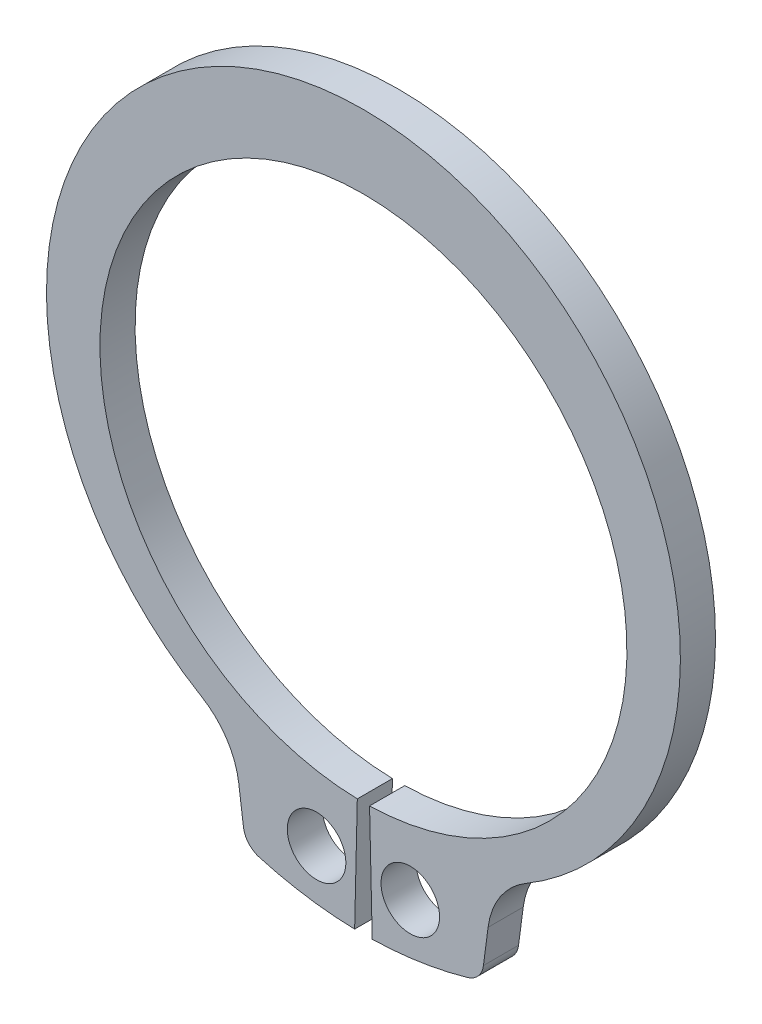
ISO-10303-21;
HEADER;
FILE_DESCRIPTION(('STEP AP214'),'2;1');
FILE_NAME('part.step','',(''),(''),'','','');
FILE_SCHEMA(('AUTOMOTIVE_DESIGN { 1 0 10303 214 1 1 1 1 }'));
ENDSEC;
DATA;
#1=APPLICATION_CONTEXT('core data for automotive mechanical design processes');
#2=APPLICATION_PROTOCOL_DEFINITION('international standard','automotive_design',2000,#1);
#3=PRODUCT_CONTEXT('',#1,'mechanical');
#4=PRODUCT('Part','Part','',(#3));
#5=PRODUCT_RELATED_PRODUCT_CATEGORY('part','',(#4));
#6=PRODUCT_DEFINITION_FORMATION('','',#4);
#7=PRODUCT_DEFINITION_CONTEXT('part definition',#1,'design');
#8=PRODUCT_DEFINITION('design','',#6,#7);
#9=PRODUCT_DEFINITION_SHAPE('','',#8);
#10=(LENGTH_UNIT() NAMED_UNIT(*) SI_UNIT(.MILLI.,.METRE.));
#11=(NAMED_UNIT(*) PLANE_ANGLE_UNIT() SI_UNIT($,.RADIAN.));
#12=(NAMED_UNIT(*) SI_UNIT($,.STERADIAN.) SOLID_ANGLE_UNIT());
#13=UNCERTAINTY_MEASURE_WITH_UNIT(LENGTH_MEASURE(1.E-05),#10,'distance_accuracy_value','');
#14=(GEOMETRIC_REPRESENTATION_CONTEXT(3) GLOBAL_UNCERTAINTY_ASSIGNED_CONTEXT((#13)) GLOBAL_UNIT_ASSIGNED_CONTEXT((#10,
#11,#12)) REPRESENTATION_CONTEXT('',''));
#15=CARTESIAN_POINT('',(0.,0.,0.));
#16=DIRECTION('',(0.,0.,1.));
#17=DIRECTION('',(1.,0.,0.));
#18=AXIS2_PLACEMENT_3D('',#15,#16,#17);
#19=CARTESIAN_POINT('',(0.,0.,-1.2));
#20=DIRECTION('',(0.,0.,1.));
#21=DIRECTION('',(1.,0.,0.));
#22=AXIS2_PLACEMENT_3D('',#19,#20,#21);
#23=CYLINDRICAL_SURFACE('',#22,9.);
#24=CARTESIAN_POINT('',(0.,0.,0.));
#25=DIRECTION('',(0.,0.,-1.));
#26=DIRECTION('',(1.,0.,0.));
#27=AXIS2_PLACEMENT_3D('',#24,#25,#26);
#28=CIRCLE('',#27,9.);
#29=CARTESIAN_POINT('',(-0.209302325581395,-8.99756592287637,0.));
#30=VERTEX_POINT('',#29);
#31=CARTESIAN_POINT('',(0.209302325581395,-8.99756592287637,0.));
#32=VERTEX_POINT('',#31);
#33=EDGE_CURVE('E157',#30,#32,#28,.T.);
#34=ORIENTED_EDGE('',*,*,#33,.F.);
#35=DIRECTION('',(0.,0.,1.));
#36=VECTOR('',#35,1.);
#37=CARTESIAN_POINT('',(-0.209302325581395,-8.99756592287637,-1.2));
#38=LINE('',#37,#36);
#39=CARTESIAN_POINT('',(-0.209302325581395,-8.99756592287637,-1.2));
#40=VERTEX_POINT('',#39);
#41=EDGE_CURVE('E11',#40,#30,#38,.T.);
#42=ORIENTED_EDGE('',*,*,#41,.F.);
#43=CARTESIAN_POINT('',(0.,0.,-1.2));
#44=DIRECTION('',(0.,0.,-1.));
#45=DIRECTION('',(1.,0.,0.));
#46=AXIS2_PLACEMENT_3D('',#43,#44,#45);
#47=CIRCLE('',#46,9.);
#48=CARTESIAN_POINT('',(0.209302325581395,-8.99756592287637,-1.2));
#49=VERTEX_POINT('',#48);
#50=EDGE_CURVE('E190',#40,#49,#47,.T.);
#51=ORIENTED_EDGE('',*,*,#50,.T.);
#52=DIRECTION('',(0.,0.,1.));
#53=VECTOR('',#52,1.);
#54=CARTESIAN_POINT('',(0.209302325581395,-8.99756592287637,-1.2));
#55=LINE('',#54,#53);
#56=EDGE_CURVE('E39',#49,#32,#55,.T.);
#57=ORIENTED_EDGE('',*,*,#56,.T.);
#58=EDGE_LOOP('',(#34,#42,#51,#57));
#59=FACE_BOUND('',#58,.T.);
#60=ADVANCED_FACE('F36',(#59),#23,.F.);
#61=CARTESIAN_POINT('',(-0.209302325581395,-8.99756592287637,-1.2));
#62=DIRECTION('',(0.999729546986264,-0.0232558139534884,0.));
#63=DIRECTION('',(0.0232558139534884,0.999729546986264,0.));
#64=AXIS2_PLACEMENT_3D('',#61,#62,#63);
#65=PLANE('',#64);
#66=DIRECTION('',(0.0232558139534884,0.999729546986264,0.));
#67=VECTOR('',#66,1.);
#68=CARTESIAN_POINT('',(-0.209302325581395,-8.99756592287637,0.));
#69=LINE('',#68,#67);
#70=CARTESIAN_POINT('',(-0.3,-12.8965111561228,0.));
#71=VERTEX_POINT('',#70);
#72=EDGE_CURVE('E188',#71,#30,#69,.T.);
#73=ORIENTED_EDGE('',*,*,#72,.F.);
#74=DIRECTION('',(0.,0.,1.));
#75=VECTOR('',#74,1.);
#76=CARTESIAN_POINT('',(-0.3,-12.8965111561228,-1.2));
#77=LINE('',#76,#75);
#78=CARTESIAN_POINT('',(-0.3,-12.8965111561228,-1.2));
#79=VERTEX_POINT('',#78);
#80=EDGE_CURVE('E45',#79,#71,#77,.T.);
#81=ORIENTED_EDGE('',*,*,#80,.F.);
#82=DIRECTION('',(0.0232558139534884,0.999729546986264,0.));
#83=VECTOR('',#82,1.);
#84=CARTESIAN_POINT('',(-0.209302325581395,-8.99756592287637,-1.2));
#85=LINE('',#84,#83);
#86=EDGE_CURVE('E147',#79,#40,#85,.T.);
#87=ORIENTED_EDGE('',*,*,#86,.T.);
#88=ORIENTED_EDGE('',*,*,#41,.T.);
#89=EDGE_LOOP('',(#73,#81,#87,#88));
#90=FACE_BOUND('',#89,.T.);
#91=ADVANCED_FACE('F210',(#90),#65,.T.);
#92=CARTESIAN_POINT('',(0.,0.,-1.2));
#93=DIRECTION('',(0.,0.,1.));
#94=DIRECTION('',(1.,0.,0.));
#95=AXIS2_PLACEMENT_3D('',#92,#93,#94);
#96=CYLINDRICAL_SURFACE('',#95,12.9);
#97=CARTESIAN_POINT('',(0.,0.,0.));
#98=DIRECTION('',(0.,0.,1.));
#99=DIRECTION('',(1.,0.,0.));
#100=AXIS2_PLACEMENT_3D('',#97,#98,#99);
#101=CIRCLE('',#100,12.9);
#102=CARTESIAN_POINT('',(-3.56180012924144,-12.3985313581624,0.));
#103=VERTEX_POINT('',#102);
#104=EDGE_CURVE('E134',#103,#71,#101,.T.);
#105=ORIENTED_EDGE('',*,*,#104,.F.);
#106=DIRECTION('',(0.,0.,1.));
#107=VECTOR('',#106,1.);
#108=CARTESIAN_POINT('',(-3.56180012924144,-12.3985313581624,-1.2));
#109=LINE('',#108,#107);
#110=CARTESIAN_POINT('',(-3.56180012924144,-12.3985313581624,-1.2));
#111=VERTEX_POINT('',#110);
#112=EDGE_CURVE('E129',#111,#103,#109,.T.);
#113=ORIENTED_EDGE('',*,*,#112,.F.);
#114=CARTESIAN_POINT('',(0.,0.,-1.2));
#115=DIRECTION('',(0.,0.,1.));
#116=DIRECTION('',(1.,0.,0.));
#117=AXIS2_PLACEMENT_3D('',#114,#115,#116);
#118=CIRCLE('',#117,12.9);
#119=EDGE_CURVE('E132',#111,#79,#118,.T.);
#120=ORIENTED_EDGE('',*,*,#119,.T.);
#121=ORIENTED_EDGE('',*,*,#80,.T.);
#122=EDGE_LOOP('',(#105,#113,#120,#121));
#123=FACE_BOUND('',#122,.T.);
#124=ADVANCED_FACE('F131',(#123),#96,.T.);
#125=CARTESIAN_POINT('',(-3.35471872637856,-11.6776865117576,-1.2));
#126=DIRECTION('',(0.,0.,1.));
#127=DIRECTION('',(1.,0.,0.));
#128=AXIS2_PLACEMENT_3D('',#125,#126,#127);
#129=CYLINDRICAL_SURFACE('',#128,0.749999999999998);
#130=CARTESIAN_POINT('',(-3.35471872637856,-11.6776865117576,0.));
#131=DIRECTION('',(0.,0.,1.));
#132=DIRECTION('',(1.,0.,0.));
#133=AXIS2_PLACEMENT_3D('',#130,#131,#132);
#134=CIRCLE('',#133,0.749999999999998);
#135=CARTESIAN_POINT('',(-4.09830237240892,-11.7755811559226,0.));
#136=VERTEX_POINT('',#135);
#137=EDGE_CURVE('E185',#136,#103,#134,.T.);
#138=ORIENTED_EDGE('',*,*,#137,.F.);
#139=DIRECTION('',(0.,0.,1.));
#140=VECTOR('',#139,1.);
#141=CARTESIAN_POINT('',(-4.09830237240892,-11.7755811559226,-1.2));
#142=LINE('',#141,#140);
#143=CARTESIAN_POINT('',(-4.09830237240892,-11.7755811559226,-1.2));
#144=VERTEX_POINT('',#143);
#145=EDGE_CURVE('E139',#144,#136,#142,.T.);
#146=ORIENTED_EDGE('',*,*,#145,.F.);
#147=CARTESIAN_POINT('',(-3.35471872637856,-11.6776865117576,-1.2));
#148=DIRECTION('',(0.,0.,1.));
#149=DIRECTION('',(1.,0.,0.));
#150=AXIS2_PLACEMENT_3D('',#147,#148,#149);
#151=CIRCLE('',#150,0.749999999999998);
#152=EDGE_CURVE('E145',#144,#111,#151,.T.);
#153=ORIENTED_EDGE('',*,*,#152,.T.);
#154=ORIENTED_EDGE('',*,*,#112,.T.);
#155=EDGE_LOOP('',(#138,#146,#153,#154));
#156=FACE_BOUND('',#155,.T.);
#157=ADVANCED_FACE('F149',(#156),#129,.T.);
#158=CARTESIAN_POINT('',(-4.25782020599012,-10.5639229154452,-1.2));
#159=DIRECTION('',(-0.99144486137381,-0.130526192220052,0.));
#160=DIRECTION('',(0.130526192220052,-0.99144486137381,0.));
#161=AXIS2_PLACEMENT_3D('',#158,#159,#160);
#162=PLANE('',#161);
#163=DIRECTION('',(0.130526192220052,-0.99144486137381,0.));
#164=VECTOR('',#163,1.);
#165=CARTESIAN_POINT('',(-4.25782020599012,-10.5639229154452,0.));
#166=LINE('',#165,#164);
#167=CARTESIAN_POINT('',(-4.25782020599012,-10.5639229154452,0.));
#168=VERTEX_POINT('',#167);
#169=EDGE_CURVE('E182',#168,#136,#166,.T.);
#170=ORIENTED_EDGE('',*,*,#169,.F.);
#171=DIRECTION('',(0.,0.,1.));
#172=VECTOR('',#171,1.);
#173=CARTESIAN_POINT('',(-4.25782020599012,-10.5639229154452,-1.2));
#174=LINE('',#173,#172);
#175=CARTESIAN_POINT('',(-4.25782020599012,-10.5639229154452,-1.2));
#176=VERTEX_POINT('',#175);
#177=EDGE_CURVE('E194',#176,#168,#174,.T.);
#178=ORIENTED_EDGE('',*,*,#177,.F.);
#179=DIRECTION('',(0.130526192220052,-0.99144486137381,0.));
#180=VECTOR('',#179,1.);
#181=CARTESIAN_POINT('',(-4.25782020599012,-10.5639229154452,-1.2));
#182=LINE('',#181,#180);
#183=EDGE_CURVE('E150',#176,#144,#182,.T.);
#184=ORIENTED_EDGE('',*,*,#183,.T.);
#185=ORIENTED_EDGE('',*,*,#145,.T.);
#186=EDGE_LOOP('',(#170,#178,#184,#185));
#187=FACE_BOUND('',#186,.T.);
#188=ADVANCED_FACE('F223',(#187),#162,.T.);
#189=CARTESIAN_POINT('',(-6.88398382258035,-10.9096639146425,-1.2));
#190=DIRECTION('',(0.,0.,1.));
#191=DIRECTION('',(1.,0.,0.));
#192=AXIS2_PLACEMENT_3D('',#189,#190,#191);
#193=CYLINDRICAL_SURFACE('',#192,2.64882467891482);
#194=CARTESIAN_POINT('',(-6.88398382258035,-10.9096639146425,0.));
#195=DIRECTION('',(0.,0.,-1.));
#196=DIRECTION('',(1.,0.,0.));
#197=AXIS2_PLACEMENT_3D('',#194,#195,#196);
#198=CIRCLE('',#197,2.64882467891482);
#199=CARTESIAN_POINT('',(-5.53075827811954,-8.6325928122289,0.));
#200=VERTEX_POINT('',#199);
#201=EDGE_CURVE('E179',#200,#168,#198,.T.);
#202=ORIENTED_EDGE('',*,*,#201,.F.);
#203=DIRECTION('',(0.,0.,1.));
#204=VECTOR('',#203,1.);
#205=CARTESIAN_POINT('',(-5.53075827811954,-8.6325928122289,-1.2));
#206=LINE('',#205,#204);
#207=CARTESIAN_POINT('',(-5.53075827811954,-8.6325928122289,-1.2));
#208=VERTEX_POINT('',#207);
#209=EDGE_CURVE('E196',#208,#200,#206,.T.);
#210=ORIENTED_EDGE('',*,*,#209,.F.);
#211=CARTESIAN_POINT('',(-6.88398382258035,-10.9096639146425,-1.2));
#212=DIRECTION('',(0.,0.,-1.));
#213=DIRECTION('',(1.,0.,0.));
#214=AXIS2_PLACEMENT_3D('',#211,#212,#213);
#215=CIRCLE('',#214,2.64882467891482);
#216=EDGE_CURVE('E152',#208,#176,#215,.T.);
#217=ORIENTED_EDGE('',*,*,#216,.T.);
#218=ORIENTED_EDGE('',*,*,#177,.T.);
#219=EDGE_LOOP('',(#202,#210,#217,#218));
#220=FACE_BOUND('',#219,.T.);
#221=ADVANCED_FACE('F226',(#220),#193,.F.);
#222=CARTESIAN_POINT('',(0.,0.674007924870493,-1.2));
#223=DIRECTION('',(0.,0.,1.));
#224=DIRECTION('',(1.,0.,0.));
#225=AXIS2_PLACEMENT_3D('',#222,#223,#224);
#226=CYLINDRICAL_SURFACE('',#225,10.8259920751295);
#227=CARTESIAN_POINT('',(0.,0.674007924870493,0.));
#228=DIRECTION('',(0.,0.,1.));
#229=DIRECTION('',(1.,0.,0.));
#230=AXIS2_PLACEMENT_3D('',#227,#228,#229);
#231=CIRCLE('',#230,10.8259920751295);
#232=CARTESIAN_POINT('',(5.53075827811955,-8.6325928122289,0.));
#233=VERTEX_POINT('',#232);
#234=EDGE_CURVE('E176',#233,#200,#231,.T.);
#235=ORIENTED_EDGE('',*,*,#234,.F.);
#236=DIRECTION('',(0.,0.,1.));
#237=VECTOR('',#236,1.);
#238=CARTESIAN_POINT('',(5.53075827811955,-8.6325928122289,-1.2));
#239=LINE('',#238,#237);
#240=CARTESIAN_POINT('',(5.53075827811955,-8.6325928122289,-1.2));
#241=VERTEX_POINT('',#240);
#242=EDGE_CURVE('E198',#241,#233,#239,.T.);
#243=ORIENTED_EDGE('',*,*,#242,.F.);
#244=CARTESIAN_POINT('',(0.,0.674007924870493,-1.2));
#245=DIRECTION('',(0.,0.,1.));
#246=DIRECTION('',(1.,0.,0.));
#247=AXIS2_PLACEMENT_3D('',#244,#245,#246);
#248=CIRCLE('',#247,10.8259920751295);
#249=EDGE_CURVE('E300',#241,#208,#248,.T.);
#250=ORIENTED_EDGE('',*,*,#249,.T.);
#251=ORIENTED_EDGE('',*,*,#209,.T.);
#252=EDGE_LOOP('',(#235,#243,#250,#251));
#253=FACE_BOUND('',#252,.T.);
#254=ADVANCED_FACE('F230',(#253),#226,.T.);
#255=CARTESIAN_POINT('',(6.88398382258035,-10.9096639146425,-1.2));
#256=DIRECTION('',(0.,0.,1.));
#257=DIRECTION('',(1.,0.,0.));
#258=AXIS2_PLACEMENT_3D('',#255,#256,#257);
#259=CYLINDRICAL_SURFACE('',#258,2.64882467891482);
#260=CARTESIAN_POINT('',(6.88398382258035,-10.9096639146425,0.));
#261=DIRECTION('',(0.,0.,-1.));
#262=DIRECTION('',(1.,0.,0.));
#263=AXIS2_PLACEMENT_3D('',#260,#261,#262);
#264=CIRCLE('',#263,2.64882467891482);
#265=CARTESIAN_POINT('',(4.25782020599012,-10.5639229154452,0.));
#266=VERTEX_POINT('',#265);
#267=EDGE_CURVE('E173',#266,#233,#264,.T.);
#268=ORIENTED_EDGE('',*,*,#267,.F.);
#269=DIRECTION('',(0.,0.,1.));
#270=VECTOR('',#269,1.);
#271=CARTESIAN_POINT('',(4.25782020599012,-10.5639229154452,-1.2));
#272=LINE('',#271,#270);
#273=CARTESIAN_POINT('',(4.25782020599012,-10.5639229154452,-1.2));
#274=VERTEX_POINT('',#273);
#275=EDGE_CURVE('E200',#274,#266,#272,.T.);
#276=ORIENTED_EDGE('',*,*,#275,.F.);
#277=CARTESIAN_POINT('',(6.88398382258035,-10.9096639146425,-1.2));
#278=DIRECTION('',(0.,0.,-1.));
#279=DIRECTION('',(1.,0.,0.));
#280=AXIS2_PLACEMENT_3D('',#277,#278,#279);
#281=CIRCLE('',#280,2.64882467891482);
#282=EDGE_CURVE('E297',#274,#241,#281,.T.);
#283=ORIENTED_EDGE('',*,*,#282,.T.);
#284=ORIENTED_EDGE('',*,*,#242,.T.);
#285=EDGE_LOOP('',(#268,#276,#283,#284));
#286=FACE_BOUND('',#285,.T.);
#287=ADVANCED_FACE('F234',(#286),#259,.F.);
#288=CARTESIAN_POINT('',(4.25782020599012,-10.5639229154452,-1.2));
#289=DIRECTION('',(0.99144486137381,-0.130526192220052,0.));
#290=DIRECTION('',(0.130526192220052,0.99144486137381,0.));
#291=AXIS2_PLACEMENT_3D('',#288,#289,#290);
#292=PLANE('',#291);
#293=DIRECTION('',(0.130526192220052,0.99144486137381,0.));
#294=VECTOR('',#293,1.);
#295=CARTESIAN_POINT('',(4.25782020599012,-10.5639229154452,0.));
#296=LINE('',#295,#294);
#297=CARTESIAN_POINT('',(4.09830237240892,-11.7755811559226,0.));
#298=VERTEX_POINT('',#297);
#299=EDGE_CURVE('E170',#298,#266,#296,.T.);
#300=ORIENTED_EDGE('',*,*,#299,.F.);
#301=DIRECTION('',(0.,0.,1.));
#302=VECTOR('',#301,1.);
#303=CARTESIAN_POINT('',(4.09830237240892,-11.7755811559226,-1.2));
#304=LINE('',#303,#302);
#305=CARTESIAN_POINT('',(4.09830237240892,-11.7755811559226,-1.2));
#306=VERTEX_POINT('',#305);
#307=EDGE_CURVE('E202',#306,#298,#304,.T.);
#308=ORIENTED_EDGE('',*,*,#307,.F.);
#309=DIRECTION('',(0.130526192220052,0.99144486137381,0.));
#310=VECTOR('',#309,1.);
#311=CARTESIAN_POINT('',(4.25782020599012,-10.5639229154452,-1.2));
#312=LINE('',#311,#310);
#313=EDGE_CURVE('E294',#306,#274,#312,.T.);
#314=ORIENTED_EDGE('',*,*,#313,.T.);
#315=ORIENTED_EDGE('',*,*,#275,.T.);
#316=EDGE_LOOP('',(#300,#308,#314,#315));
#317=FACE_BOUND('',#316,.T.);
#318=ADVANCED_FACE('F238',(#317),#292,.T.);
#319=CARTESIAN_POINT('',(3.35471872637856,-11.6776865117576,-1.2));
#320=DIRECTION('',(0.,0.,1.));
#321=DIRECTION('',(1.,0.,0.));
#322=AXIS2_PLACEMENT_3D('',#319,#320,#321);
#323=CYLINDRICAL_SURFACE('',#322,0.749999999999998);
#324=CARTESIAN_POINT('',(3.35471872637856,-11.6776865117576,0.));
#325=DIRECTION('',(0.,0.,1.));
#326=DIRECTION('',(-1.,0.,0.));
#327=AXIS2_PLACEMENT_3D('',#324,#325,#326);
#328=CIRCLE('',#327,0.749999999999998);
#329=CARTESIAN_POINT('',(3.56180012924144,-12.3985313581624,0.));
#330=VERTEX_POINT('',#329);
#331=EDGE_CURVE('E167',#330,#298,#328,.T.);
#332=ORIENTED_EDGE('',*,*,#331,.F.);
#333=DIRECTION('',(0.,0.,1.));
#334=VECTOR('',#333,1.);
#335=CARTESIAN_POINT('',(3.56180012924144,-12.3985313581624,-1.2));
#336=LINE('',#335,#334);
#337=CARTESIAN_POINT('',(3.56180012924144,-12.3985313581624,-1.2));
#338=VERTEX_POINT('',#337);
#339=EDGE_CURVE('E204',#338,#330,#336,.T.);
#340=ORIENTED_EDGE('',*,*,#339,.F.);
#341=CARTESIAN_POINT('',(3.35471872637856,-11.6776865117576,-1.2));
#342=DIRECTION('',(0.,0.,1.));
#343=DIRECTION('',(-1.,0.,0.));
#344=AXIS2_PLACEMENT_3D('',#341,#342,#343);
#345=CIRCLE('',#344,0.749999999999998);
#346=EDGE_CURVE('E291',#338,#306,#345,.T.);
#347=ORIENTED_EDGE('',*,*,#346,.T.);
#348=ORIENTED_EDGE('',*,*,#307,.T.);
#349=EDGE_LOOP('',(#332,#340,#347,#348));
#350=FACE_BOUND('',#349,.T.);
#351=ADVANCED_FACE('F242',(#350),#323,.T.);
#352=CARTESIAN_POINT('',(0.,0.,-1.2));
#353=DIRECTION('',(0.,0.,1.));
#354=DIRECTION('',(1.,0.,0.));
#355=AXIS2_PLACEMENT_3D('',#352,#353,#354);
#356=CYLINDRICAL_SURFACE('',#355,12.9);
#357=CARTESIAN_POINT('',(0.,0.,0.));
#358=DIRECTION('',(0.,0.,1.));
#359=DIRECTION('',(1.,0.,0.));
#360=AXIS2_PLACEMENT_3D('',#357,#358,#359);
#361=CIRCLE('',#360,12.9);
#362=CARTESIAN_POINT('',(0.299999999999995,-12.8965111561228,0.));
#363=VERTEX_POINT('',#362);
#364=EDGE_CURVE('E164',#363,#330,#361,.T.);
#365=ORIENTED_EDGE('',*,*,#364,.F.);
#366=DIRECTION('',(0.,0.,1.));
#367=VECTOR('',#366,1.);
#368=CARTESIAN_POINT('',(0.299999999999995,-12.8965111561228,-1.2));
#369=LINE('',#368,#367);
#370=CARTESIAN_POINT('',(0.299999999999995,-12.8965111561228,-1.2));
#371=VERTEX_POINT('',#370);
#372=EDGE_CURVE('E205',#371,#363,#369,.T.);
#373=ORIENTED_EDGE('',*,*,#372,.F.);
#374=CARTESIAN_POINT('',(0.,0.,-1.2));
#375=DIRECTION('',(0.,0.,1.));
#376=DIRECTION('',(1.,0.,0.));
#377=AXIS2_PLACEMENT_3D('',#374,#375,#376);
#378=CIRCLE('',#377,12.9);
#379=EDGE_CURVE('E288',#371,#338,#378,.T.);
#380=ORIENTED_EDGE('',*,*,#379,.T.);
#381=ORIENTED_EDGE('',*,*,#339,.T.);
#382=EDGE_LOOP('',(#365,#373,#380,#381));
#383=FACE_BOUND('',#382,.T.);
#384=ADVANCED_FACE('F246',(#383),#356,.T.);
#385=CARTESIAN_POINT('',(0.209302325581395,-8.99756592287637,-1.2));
#386=DIRECTION('',(-0.999729546986264,-0.0232558139534884,0.));
#387=DIRECTION('',(0.0232558139534884,-0.999729546986264,0.));
#388=AXIS2_PLACEMENT_3D('',#385,#386,#387);
#389=PLANE('',#388);
#390=DIRECTION('',(0.0232558139534884,-0.999729546986264,0.));
#391=VECTOR('',#390,1.);
#392=CARTESIAN_POINT('',(0.209302325581395,-8.99756592287637,0.));
#393=LINE('',#392,#391);
#394=EDGE_CURVE('E160',#32,#363,#393,.T.);
#395=ORIENTED_EDGE('',*,*,#394,.F.);
#396=ORIENTED_EDGE('',*,*,#56,.F.);
#397=DIRECTION('',(0.0232558139534884,-0.999729546986264,0.));
#398=VECTOR('',#397,1.);
#399=CARTESIAN_POINT('',(0.209302325581395,-8.99756592287637,-1.2));
#400=LINE('',#399,#398);
#401=EDGE_CURVE('E286',#49,#371,#400,.T.);
#402=ORIENTED_EDGE('',*,*,#401,.T.);
#403=ORIENTED_EDGE('',*,*,#372,.T.);
#404=EDGE_LOOP('',(#395,#396,#402,#403));
#405=FACE_BOUND('',#404,.T.);
#406=ADVANCED_FACE('F207',(#405),#389,.T.);
#407=CARTESIAN_POINT('',(0.,0.,-1.2));
#408=DIRECTION('',(0.,0.,1.));
#409=DIRECTION('',(1.,0.,0.));
#410=AXIS2_PLACEMENT_3D('',#407,#408,#409);
#411=PLANE('',#410);
#412=CARTESIAN_POINT('',(-1.6,-11.0851251684408,-1.2));
#413=DIRECTION('',(0.,0.,1.));
#414=DIRECTION('',(1.,0.,0.));
#415=AXIS2_PLACEMENT_3D('',#412,#413,#414);
#416=CIRCLE('',#415,1.);
#417=CARTESIAN_POINT('',(-0.6,-11.0851251684408,-1.2));
#418=VERTEX_POINT('',#417);
#419=EDGE_CURVE('E273',#418,#418,#416,.T.);
#420=ORIENTED_EDGE('',*,*,#419,.T.);
#421=EDGE_LOOP('',(#420));
#422=FACE_BOUND('',#421,.T.);
#423=CARTESIAN_POINT('',(1.6,-11.0851251684408,-1.2));
#424=DIRECTION('',(0.,0.,1.));
#425=DIRECTION('',(1.,0.,0.));
#426=AXIS2_PLACEMENT_3D('',#423,#424,#425);
#427=CIRCLE('',#426,1.);
#428=CARTESIAN_POINT('',(2.6,-11.0851251684408,-1.2));
#429=VERTEX_POINT('',#428);
#430=EDGE_CURVE('E161',#429,#429,#427,.T.);
#431=ORIENTED_EDGE('',*,*,#430,.T.);
#432=EDGE_LOOP('',(#431));
#433=FACE_BOUND('',#432,.T.);
#434=ORIENTED_EDGE('',*,*,#50,.F.);
#435=ORIENTED_EDGE('',*,*,#86,.F.);
#436=ORIENTED_EDGE('',*,*,#119,.F.);
#437=ORIENTED_EDGE('',*,*,#152,.F.);
#438=ORIENTED_EDGE('',*,*,#183,.F.);
#439=ORIENTED_EDGE('',*,*,#216,.F.);
#440=ORIENTED_EDGE('',*,*,#249,.F.);
#441=ORIENTED_EDGE('',*,*,#282,.F.);
#442=ORIENTED_EDGE('',*,*,#313,.F.);
#443=ORIENTED_EDGE('',*,*,#346,.F.);
#444=ORIENTED_EDGE('',*,*,#379,.F.);
#445=ORIENTED_EDGE('',*,*,#401,.F.);
#446=EDGE_LOOP('',(#434,#435,#436,#437,#438,#439,#440,#441,#442,#443,#444,#445));
#447=FACE_BOUND('',#446,.T.);
#448=ADVANCED_FACE('F143',(#422,#433,#447),#411,.F.);
#449=CARTESIAN_POINT('',(0.,0.,0.));
#450=DIRECTION('',(0.,0.,1.));
#451=DIRECTION('',(1.,0.,0.));
#452=AXIS2_PLACEMENT_3D('',#449,#450,#451);
#453=PLANE('',#452);
#454=CARTESIAN_POINT('',(-1.6,-11.0851251684408,0.));
#455=DIRECTION('',(0.,0.,1.));
#456=DIRECTION('',(1.,0.,0.));
#457=AXIS2_PLACEMENT_3D('',#454,#455,#456);
#458=CIRCLE('',#457,1.);
#459=CARTESIAN_POINT('',(-0.6,-11.0851251684408,0.));
#460=VERTEX_POINT('',#459);
#461=EDGE_CURVE('E276',#460,#460,#458,.T.);
#462=ORIENTED_EDGE('',*,*,#461,.F.);
#463=EDGE_LOOP('',(#462));
#464=FACE_BOUND('',#463,.T.);
#465=CARTESIAN_POINT('',(1.6,-11.0851251684408,0.));
#466=DIRECTION('',(0.,0.,1.));
#467=DIRECTION('',(1.,0.,0.));
#468=AXIS2_PLACEMENT_3D('',#465,#466,#467);
#469=CIRCLE('',#468,1.);
#470=CARTESIAN_POINT('',(2.6,-11.0851251684408,0.));
#471=VERTEX_POINT('',#470);
#472=EDGE_CURVE('E278',#471,#471,#469,.T.);
#473=ORIENTED_EDGE('',*,*,#472,.F.);
#474=EDGE_LOOP('',(#473));
#475=FACE_BOUND('',#474,.T.);
#476=ORIENTED_EDGE('',*,*,#33,.T.);
#477=ORIENTED_EDGE('',*,*,#394,.T.);
#478=ORIENTED_EDGE('',*,*,#364,.T.);
#479=ORIENTED_EDGE('',*,*,#331,.T.);
#480=ORIENTED_EDGE('',*,*,#299,.T.);
#481=ORIENTED_EDGE('',*,*,#267,.T.);
#482=ORIENTED_EDGE('',*,*,#234,.T.);
#483=ORIENTED_EDGE('',*,*,#201,.T.);
#484=ORIENTED_EDGE('',*,*,#169,.T.);
#485=ORIENTED_EDGE('',*,*,#137,.T.);
#486=ORIENTED_EDGE('',*,*,#104,.T.);
#487=ORIENTED_EDGE('',*,*,#72,.T.);
#488=EDGE_LOOP('',(#476,#477,#478,#479,#480,#481,#482,#483,#484,#485,#486,#487));
#489=FACE_BOUND('',#488,.T.);
#490=ADVANCED_FACE('F209',(#464,#475,#489),#453,.T.);
#491=CARTESIAN_POINT('',(1.6,-11.0851251684408,-1.2));
#492=DIRECTION('',(0.,0.,1.));
#493=DIRECTION('',(1.,0.,0.));
#494=AXIS2_PLACEMENT_3D('',#491,#492,#493);
#495=CYLINDRICAL_SURFACE('',#494,1.);
#496=ORIENTED_EDGE('',*,*,#430,.F.);
#497=EDGE_LOOP('',(#496));
#498=FACE_BOUND('',#497,.T.);
#499=ORIENTED_EDGE('',*,*,#472,.T.);
#500=EDGE_LOOP('',(#499));
#501=FACE_BOUND('',#500,.T.);
#502=ADVANCED_FACE('F258',(#498,#501),#495,.F.);
#503=CARTESIAN_POINT('',(-1.6,-11.0851251684408,-1.2));
#504=DIRECTION('',(0.,0.,1.));
#505=DIRECTION('',(1.,0.,0.));
#506=AXIS2_PLACEMENT_3D('',#503,#504,#505);
#507=CYLINDRICAL_SURFACE('',#506,1.);
#508=ORIENTED_EDGE('',*,*,#419,.F.);
#509=EDGE_LOOP('',(#508));
#510=FACE_BOUND('',#509,.T.);
#511=ORIENTED_EDGE('',*,*,#461,.T.);
#512=EDGE_LOOP('',(#511));
#513=FACE_BOUND('',#512,.T.);
#514=ADVANCED_FACE('F265',(#510,#513),#507,.F.);
#515=CLOSED_SHELL('',(#60,#91,#124,#157,#188,#221,#254,#287,#318,#351,#384,#406,#448,#490,#502,#514));
#516=MANIFOLD_SOLID_BREP('B2',#515);
#517=ADVANCED_BREP_SHAPE_REPRESENTATION('',(#18,#516),#14);
#518=SHAPE_DEFINITION_REPRESENTATION(#9,#517);
ENDSEC;
END-ISO-10303-21;
